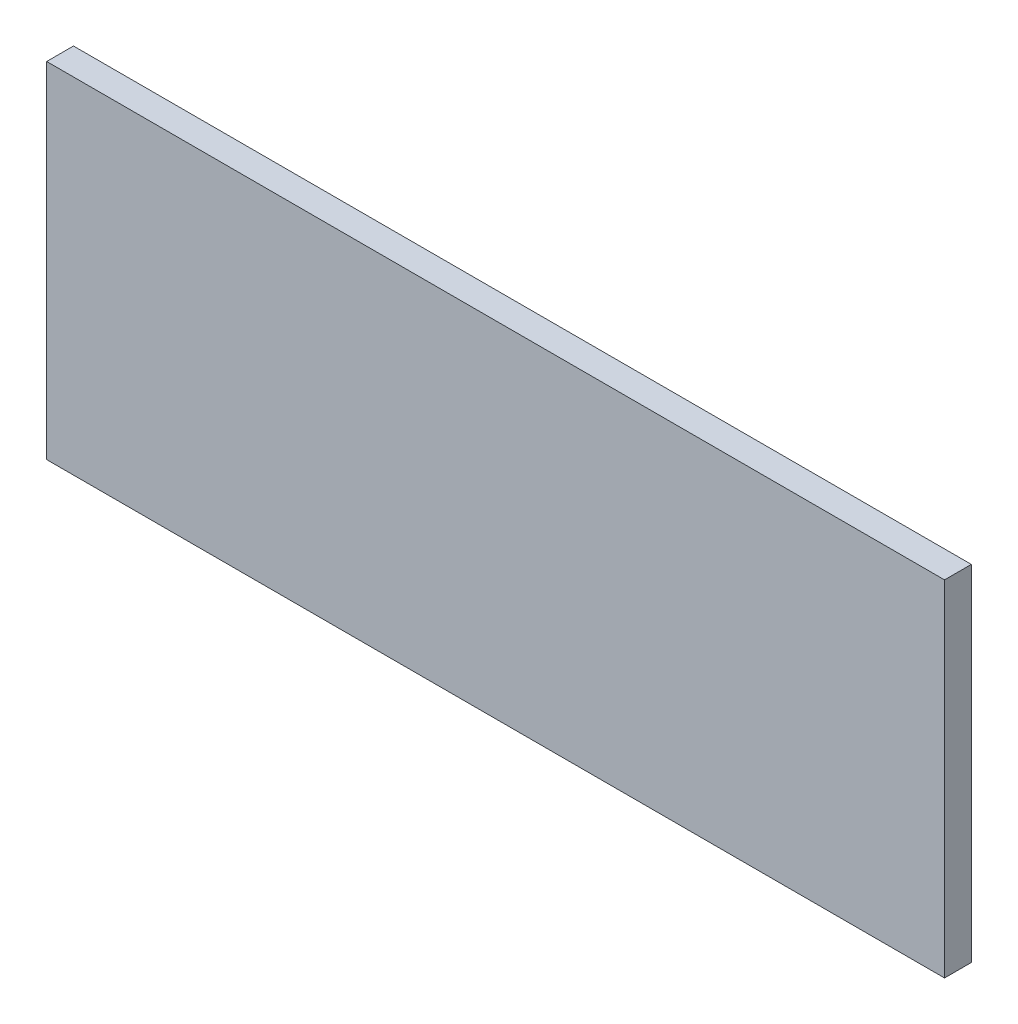
ISO-10303-21;
HEADER;
FILE_DESCRIPTION(('STEP AP214'),'2;1');
FILE_NAME('part.step','',(''),(''),'','','');
FILE_SCHEMA(('AUTOMOTIVE_DESIGN { 1 0 10303 214 1 1 1 1 }'));
ENDSEC;
DATA;
#1=APPLICATION_CONTEXT('core data for automotive mechanical design processes');
#2=APPLICATION_PROTOCOL_DEFINITION('international standard','automotive_design',2000,#1);
#3=PRODUCT_CONTEXT('',#1,'mechanical');
#4=PRODUCT('Part','Part','',(#3));
#5=PRODUCT_RELATED_PRODUCT_CATEGORY('part','',(#4));
#6=PRODUCT_DEFINITION_FORMATION('','',#4);
#7=PRODUCT_DEFINITION_CONTEXT('part definition',#1,'design');
#8=PRODUCT_DEFINITION('design','',#6,#7);
#9=PRODUCT_DEFINITION_SHAPE('','',#8);
#10=(LENGTH_UNIT() NAMED_UNIT(*) SI_UNIT(.MILLI.,.METRE.));
#11=(NAMED_UNIT(*) PLANE_ANGLE_UNIT() SI_UNIT($,.RADIAN.));
#12=(NAMED_UNIT(*) SI_UNIT($,.STERADIAN.) SOLID_ANGLE_UNIT());
#13=UNCERTAINTY_MEASURE_WITH_UNIT(LENGTH_MEASURE(1.E-05),#10,'distance_accuracy_value','');
#14=(GEOMETRIC_REPRESENTATION_CONTEXT(3) GLOBAL_UNCERTAINTY_ASSIGNED_CONTEXT((#13)) GLOBAL_UNIT_ASSIGNED_CONTEXT((#10,
#11,#12)) REPRESENTATION_CONTEXT('',''));
#15=CARTESIAN_POINT('',(0.,0.,0.));
#16=DIRECTION('',(0.,0.,1.));
#17=DIRECTION('',(1.,0.,0.));
#18=AXIS2_PLACEMENT_3D('',#15,#16,#17);
#19=CARTESIAN_POINT('',(319.05,19.05,19.05));
#20=DIRECTION('',(-1.,0.,0.));
#21=DIRECTION('',(0.,0.,1.));
#22=AXIS2_PLACEMENT_3D('',#19,#20,#21);
#23=PLANE('',#22);
#24=DIRECTION('',(0.,1.,0.));
#25=VECTOR('',#24,1.);
#26=CARTESIAN_POINT('',(319.05,19.05,0.));
#27=LINE('',#26,#25);
#28=CARTESIAN_POINT('',(319.05,-226.,0.));
#29=VERTEX_POINT('',#28);
#30=CARTESIAN_POINT('',(319.05,19.05,0.));
#31=VERTEX_POINT('',#30);
#32=EDGE_CURVE('E96',#29,#31,#27,.T.);
#33=ORIENTED_EDGE('',*,*,#32,.T.);
#34=DIRECTION('',(0.,0.,-1.));
#35=VECTOR('',#34,1.);
#36=CARTESIAN_POINT('',(319.05,19.05,19.05));
#37=LINE('',#36,#35);
#38=CARTESIAN_POINT('',(319.05,19.05,19.05));
#39=VERTEX_POINT('',#38);
#40=EDGE_CURVE('E11',#39,#31,#37,.T.);
#41=ORIENTED_EDGE('',*,*,#40,.F.);
#42=DIRECTION('',(0.,1.,0.));
#43=VECTOR('',#42,1.);
#44=CARTESIAN_POINT('',(319.05,19.05,19.05));
#45=LINE('',#44,#43);
#46=CARTESIAN_POINT('',(319.05,-226.,19.05));
#47=VERTEX_POINT('',#46);
#48=EDGE_CURVE('E84',#47,#39,#45,.T.);
#49=ORIENTED_EDGE('',*,*,#48,.F.);
#50=DIRECTION('',(0.,0.,-1.));
#51=VECTOR('',#50,1.);
#52=CARTESIAN_POINT('',(319.05,-226.,19.05));
#53=LINE('',#52,#51);
#54=EDGE_CURVE('E92',#47,#29,#53,.T.);
#55=ORIENTED_EDGE('',*,*,#54,.T.);
#56=EDGE_LOOP('',(#33,#41,#49,#55));
#57=FACE_BOUND('',#56,.T.);
#58=ADVANCED_FACE('F33',(#57),#23,.F.);
#59=CARTESIAN_POINT('',(319.05,19.05,19.05));
#60=DIRECTION('',(0.,-1.,0.));
#61=DIRECTION('',(0.,0.,-1.));
#62=AXIS2_PLACEMENT_3D('',#59,#60,#61);
#63=PLANE('',#62);
#64=DIRECTION('',(-1.,0.,0.));
#65=VECTOR('',#64,1.);
#66=CARTESIAN_POINT('',(319.05,19.05,0.));
#67=LINE('',#66,#65);
#68=CARTESIAN_POINT('',(-319.05,19.05,0.));
#69=VERTEX_POINT('',#68);
#70=EDGE_CURVE('E88',#31,#69,#67,.T.);
#71=ORIENTED_EDGE('',*,*,#70,.T.);
#72=DIRECTION('',(0.,0.,-1.));
#73=VECTOR('',#72,1.);
#74=CARTESIAN_POINT('',(-319.05,19.05,19.05));
#75=LINE('',#74,#73);
#76=CARTESIAN_POINT('',(-319.05,19.05,19.05));
#77=VERTEX_POINT('',#76);
#78=EDGE_CURVE('E41',#77,#69,#75,.T.);
#79=ORIENTED_EDGE('',*,*,#78,.F.);
#80=DIRECTION('',(-1.,0.,0.));
#81=VECTOR('',#80,1.);
#82=CARTESIAN_POINT('',(319.05,19.05,19.05));
#83=LINE('',#82,#81);
#84=EDGE_CURVE('E79',#39,#77,#83,.T.);
#85=ORIENTED_EDGE('',*,*,#84,.F.);
#86=ORIENTED_EDGE('',*,*,#40,.T.);
#87=EDGE_LOOP('',(#71,#79,#85,#86));
#88=FACE_BOUND('',#87,.T.);
#89=ADVANCED_FACE('F87',(#88),#63,.F.);
#90=CARTESIAN_POINT('',(-319.05,19.05,19.05));
#91=DIRECTION('',(1.,0.,0.));
#92=DIRECTION('',(0.,0.,-1.));
#93=AXIS2_PLACEMENT_3D('',#90,#91,#92);
#94=PLANE('',#93);
#95=DIRECTION('',(0.,-1.,0.));
#96=VECTOR('',#95,1.);
#97=CARTESIAN_POINT('',(-319.05,19.05,0.));
#98=LINE('',#97,#96);
#99=CARTESIAN_POINT('',(-319.05,-226.,0.));
#100=VERTEX_POINT('',#99);
#101=EDGE_CURVE('E66',#69,#100,#98,.T.);
#102=ORIENTED_EDGE('',*,*,#101,.T.);
#103=DIRECTION('',(0.,0.,-1.));
#104=VECTOR('',#103,1.);
#105=CARTESIAN_POINT('',(-319.05,-226.,19.05));
#106=LINE('',#105,#104);
#107=CARTESIAN_POINT('',(-319.05,-226.,19.05));
#108=VERTEX_POINT('',#107);
#109=EDGE_CURVE('E89',#108,#100,#106,.T.);
#110=ORIENTED_EDGE('',*,*,#109,.F.);
#111=DIRECTION('',(0.,-1.,0.));
#112=VECTOR('',#111,1.);
#113=CARTESIAN_POINT('',(-319.05,19.05,19.05));
#114=LINE('',#113,#112);
#115=EDGE_CURVE('E82',#77,#108,#114,.T.);
#116=ORIENTED_EDGE('',*,*,#115,.F.);
#117=ORIENTED_EDGE('',*,*,#78,.T.);
#118=EDGE_LOOP('',(#102,#110,#116,#117));
#119=FACE_BOUND('',#118,.T.);
#120=ADVANCED_FACE('F90',(#119),#94,.F.);
#121=CARTESIAN_POINT('',(319.05,-226.,19.05));
#122=DIRECTION('',(0.,1.,0.));
#123=DIRECTION('',(0.,0.,1.));
#124=AXIS2_PLACEMENT_3D('',#121,#122,#123);
#125=PLANE('',#124);
#126=DIRECTION('',(1.,0.,0.));
#127=VECTOR('',#126,1.);
#128=CARTESIAN_POINT('',(319.05,-226.,0.));
#129=LINE('',#128,#127);
#130=EDGE_CURVE('E72',#100,#29,#129,.T.);
#131=ORIENTED_EDGE('',*,*,#130,.T.);
#132=ORIENTED_EDGE('',*,*,#54,.F.);
#133=DIRECTION('',(1.,0.,0.));
#134=VECTOR('',#133,1.);
#135=CARTESIAN_POINT('',(319.05,-226.,19.05));
#136=LINE('',#135,#134);
#137=EDGE_CURVE('E49',#108,#47,#136,.T.);
#138=ORIENTED_EDGE('',*,*,#137,.F.);
#139=ORIENTED_EDGE('',*,*,#109,.T.);
#140=EDGE_LOOP('',(#131,#132,#138,#139));
#141=FACE_BOUND('',#140,.T.);
#142=ADVANCED_FACE('F103',(#141),#125,.F.);
#143=CARTESIAN_POINT('',(0.,0.,19.05));
#144=DIRECTION('',(0.,0.,-1.));
#145=DIRECTION('',(-1.,0.,0.));
#146=AXIS2_PLACEMENT_3D('',#143,#144,#145);
#147=PLANE('',#146);
#148=ORIENTED_EDGE('',*,*,#48,.T.);
#149=ORIENTED_EDGE('',*,*,#84,.T.);
#150=ORIENTED_EDGE('',*,*,#115,.T.);
#151=ORIENTED_EDGE('',*,*,#137,.T.);
#152=EDGE_LOOP('',(#148,#149,#150,#151));
#153=FACE_BOUND('',#152,.T.);
#154=ADVANCED_FACE('F80',(#153),#147,.F.);
#155=CARTESIAN_POINT('',(0.,0.,0.));
#156=DIRECTION('',(0.,0.,-1.));
#157=DIRECTION('',(-1.,0.,0.));
#158=AXIS2_PLACEMENT_3D('',#155,#156,#157);
#159=PLANE('',#158);
#160=ORIENTED_EDGE('',*,*,#32,.F.);
#161=ORIENTED_EDGE('',*,*,#130,.F.);
#162=ORIENTED_EDGE('',*,*,#101,.F.);
#163=ORIENTED_EDGE('',*,*,#70,.F.);
#164=EDGE_LOOP('',(#160,#161,#162,#163));
#165=FACE_BOUND('',#164,.T.);
#166=ADVANCED_FACE('F106',(#165),#159,.T.);
#167=CLOSED_SHELL('',(#58,#89,#120,#142,#154,#166));
#168=MANIFOLD_SOLID_BREP('B2',#167);
#169=ADVANCED_BREP_SHAPE_REPRESENTATION('',(#18,#168),#14);
#170=SHAPE_DEFINITION_REPRESENTATION(#9,#169);
ENDSEC;
END-ISO-10303-21;
